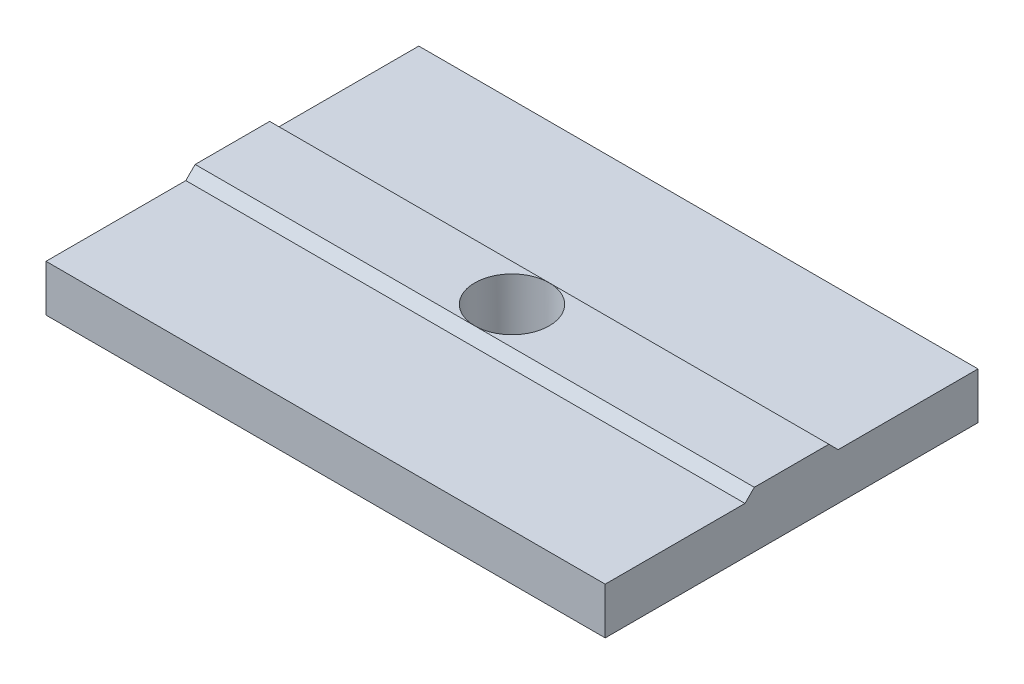
ISO-10303-21;
HEADER;
FILE_DESCRIPTION(('STEP AP214'),'2;1');
FILE_NAME('part.step','',(''),(''),'','','');
FILE_SCHEMA(('AUTOMOTIVE_DESIGN { 1 0 10303 214 1 1 1 1 }'));
ENDSEC;
DATA;
#1=APPLICATION_CONTEXT('core data for automotive mechanical design processes');
#2=APPLICATION_PROTOCOL_DEFINITION('international standard','automotive_design',2000,#1);
#3=PRODUCT_CONTEXT('',#1,'mechanical');
#4=PRODUCT('Part','Part','',(#3));
#5=PRODUCT_RELATED_PRODUCT_CATEGORY('part','',(#4));
#6=PRODUCT_DEFINITION_FORMATION('','',#4);
#7=PRODUCT_DEFINITION_CONTEXT('part definition',#1,'design');
#8=PRODUCT_DEFINITION('design','',#6,#7);
#9=PRODUCT_DEFINITION_SHAPE('','',#8);
#10=(LENGTH_UNIT() NAMED_UNIT(*) SI_UNIT(.MILLI.,.METRE.));
#11=(NAMED_UNIT(*) PLANE_ANGLE_UNIT() SI_UNIT($,.RADIAN.));
#12=(NAMED_UNIT(*) SI_UNIT($,.STERADIAN.) SOLID_ANGLE_UNIT());
#13=UNCERTAINTY_MEASURE_WITH_UNIT(LENGTH_MEASURE(1.E-05),#10,'distance_accuracy_value','');
#14=(GEOMETRIC_REPRESENTATION_CONTEXT(3) GLOBAL_UNCERTAINTY_ASSIGNED_CONTEXT((#13)) GLOBAL_UNIT_ASSIGNED_CONTEXT((#10,
#11,#12)) REPRESENTATION_CONTEXT('',''));
#15=CARTESIAN_POINT('',(0.,0.,0.));
#16=DIRECTION('',(0.,0.,1.));
#17=DIRECTION('',(1.,0.,0.));
#18=AXIS2_PLACEMENT_3D('',#15,#16,#17);
#19=CARTESIAN_POINT('',(0.,6.,0.));
#20=DIRECTION('',(0.,1.,0.));
#21=DIRECTION('',(0.,0.,1.));
#22=AXIS2_PLACEMENT_3D('',#19,#20,#21);
#23=PLANE('',#22);
#24=CARTESIAN_POINT('',(0.,6.,0.));
#25=DIRECTION('',(0.,1.,0.));
#26=DIRECTION('',(0.,0.,1.));
#27=AXIS2_PLACEMENT_3D('',#24,#25,#26);
#28=CIRCLE('',#27,4.);
#29=CARTESIAN_POINT('',(0.,6.,3.99999999999999));
#30=VERTEX_POINT('',#29);
#31=CARTESIAN_POINT('',(0.,6.,-3.99999999999999));
#32=VERTEX_POINT('',#31);
#33=EDGE_CURVE('E63',#30,#32,#28,.T.);
#34=ORIENTED_EDGE('',*,*,#33,.F.);
#35=DIRECTION('',(1.,0.,0.));
#36=VECTOR('',#35,1.);
#37=CARTESIAN_POINT('',(30.,6.,3.99999999999999));
#38=LINE('',#37,#36);
#39=CARTESIAN_POINT('',(30.,6.,3.99999999999999));
#40=VERTEX_POINT('',#39);
#41=EDGE_CURVE('E128',#30,#40,#38,.T.);
#42=ORIENTED_EDGE('',*,*,#41,.T.);
#43=DIRECTION('',(0.,0.,-1.));
#44=VECTOR('',#43,1.);
#45=CARTESIAN_POINT('',(30.,6.,5.));
#46=LINE('',#45,#44);
#47=CARTESIAN_POINT('',(30.,6.,-3.99999999999999));
#48=VERTEX_POINT('',#47);
#49=EDGE_CURVE('E165',#40,#48,#46,.T.);
#50=ORIENTED_EDGE('',*,*,#49,.T.);
#51=DIRECTION('',(-1.,0.,0.));
#52=VECTOR('',#51,1.);
#53=CARTESIAN_POINT('',(-30.,6.,-3.99999999999999));
#54=LINE('',#53,#52);
#55=EDGE_CURVE('E131',#48,#32,#54,.T.);
#56=ORIENTED_EDGE('',*,*,#55,.T.);
#57=EDGE_LOOP('',(#34,#42,#50,#56));
#58=FACE_BOUND('',#57,.T.);
#59=ADVANCED_FACE('F47',(#58),#23,.T.);
#60=CARTESIAN_POINT('',(0.,5.,0.));
#61=DIRECTION('',(0.,1.,0.));
#62=DIRECTION('',(0.,0.,1.));
#63=AXIS2_PLACEMENT_3D('',#60,#61,#62);
#64=PLANE('',#63);
#65=DIRECTION('',(0.,0.,-1.));
#66=VECTOR('',#65,1.);
#67=CARTESIAN_POINT('',(30.,5.,20.));
#68=LINE('',#67,#66);
#69=CARTESIAN_POINT('',(30.,5.,20.));
#70=VERTEX_POINT('',#69);
#71=CARTESIAN_POINT('',(30.,5.,5.));
#72=VERTEX_POINT('',#71);
#73=EDGE_CURVE('E164',#70,#72,#68,.T.);
#74=ORIENTED_EDGE('',*,*,#73,.T.);
#75=DIRECTION('',(-1.,0.,0.));
#76=VECTOR('',#75,1.);
#77=CARTESIAN_POINT('',(0.,5.,5.));
#78=LINE('',#77,#76);
#79=CARTESIAN_POINT('',(-30.,5.,5.));
#80=VERTEX_POINT('',#79);
#81=EDGE_CURVE('E168',#72,#80,#78,.T.);
#82=ORIENTED_EDGE('',*,*,#81,.T.);
#83=DIRECTION('',(0.,0.,1.));
#84=VECTOR('',#83,1.);
#85=CARTESIAN_POINT('',(-30.,5.,20.));
#86=LINE('',#85,#84);
#87=CARTESIAN_POINT('',(-30.,5.,20.));
#88=VERTEX_POINT('',#87);
#89=EDGE_CURVE('E192',#80,#88,#86,.T.);
#90=ORIENTED_EDGE('',*,*,#89,.T.);
#91=DIRECTION('',(1.,0.,0.));
#92=VECTOR('',#91,1.);
#93=CARTESIAN_POINT('',(30.,5.,20.));
#94=LINE('',#93,#92);
#95=EDGE_CURVE('E171',#88,#70,#94,.T.);
#96=ORIENTED_EDGE('',*,*,#95,.T.);
#97=EDGE_LOOP('',(#74,#82,#90,#96));
#98=FACE_BOUND('',#97,.T.);
#99=ADVANCED_FACE('F167',(#98),#64,.T.);
#100=CARTESIAN_POINT('',(-30.,5.,-20.));
#101=VERTEX_POINT('',#100);
#102=CARTESIAN_POINT('',(-30.,5.,-5.));
#103=VERTEX_POINT('',#102);
#104=EDGE_CURVE('E188',#101,#103,#86,.T.);
#105=ORIENTED_EDGE('',*,*,#104,.T.);
#106=DIRECTION('',(1.,0.,0.));
#107=VECTOR('',#106,1.);
#108=CARTESIAN_POINT('',(0.,5.,-5.));
#109=LINE('',#108,#107);
#110=CARTESIAN_POINT('',(30.,5.,-5.));
#111=VERTEX_POINT('',#110);
#112=EDGE_CURVE('E179',#103,#111,#109,.T.);
#113=ORIENTED_EDGE('',*,*,#112,.T.);
#114=CARTESIAN_POINT('',(30.,5.,-20.));
#115=VERTEX_POINT('',#114);
#116=EDGE_CURVE('E175',#111,#115,#68,.T.);
#117=ORIENTED_EDGE('',*,*,#116,.T.);
#118=DIRECTION('',(-1.,0.,0.));
#119=VECTOR('',#118,1.);
#120=CARTESIAN_POINT('',(30.,5.,-20.));
#121=LINE('',#120,#119);
#122=EDGE_CURVE('E174',#115,#101,#121,.T.);
#123=ORIENTED_EDGE('',*,*,#122,.T.);
#124=EDGE_LOOP('',(#105,#113,#117,#123));
#125=FACE_BOUND('',#124,.T.);
#126=ADVANCED_FACE('F234',(#125),#64,.T.);
#127=CARTESIAN_POINT('',(-30.,5.,20.));
#128=DIRECTION('',(1.,0.,0.));
#129=DIRECTION('',(0.,0.,-1.));
#130=AXIS2_PLACEMENT_3D('',#127,#128,#129);
#131=PLANE('',#130);
#132=DIRECTION('',(0.,0.,1.));
#133=VECTOR('',#132,1.);
#134=CARTESIAN_POINT('',(-30.,6.,5.));
#135=LINE('',#134,#133);
#136=CARTESIAN_POINT('',(-30.,6.,-3.99999999999999));
#137=VERTEX_POINT('',#136);
#138=CARTESIAN_POINT('',(-30.,6.,3.99999999999999));
#139=VERTEX_POINT('',#138);
#140=EDGE_CURVE('E145',#137,#139,#135,.T.);
#141=ORIENTED_EDGE('',*,*,#140,.F.);
#142=DIRECTION('',(0.,-0.707106781186548,-0.707106781186548));
#143=VECTOR('',#142,1.);
#144=CARTESIAN_POINT('',(-30.,6.,-3.99999999999999));
#145=LINE('',#144,#143);
#146=EDGE_CURVE('E157',#137,#103,#145,.T.);
#147=ORIENTED_EDGE('',*,*,#146,.T.);
#148=ORIENTED_EDGE('',*,*,#104,.F.);
#149=DIRECTION('',(0.,-1.,0.));
#150=VECTOR('',#149,1.);
#151=CARTESIAN_POINT('',(-30.,5.,-20.));
#152=LINE('',#151,#150);
#153=CARTESIAN_POINT('',(-30.,0.,-20.));
#154=VERTEX_POINT('',#153);
#155=EDGE_CURVE('E196',#101,#154,#152,.T.);
#156=ORIENTED_EDGE('',*,*,#155,.T.);
#157=DIRECTION('',(0.,0.,1.));
#158=VECTOR('',#157,1.);
#159=CARTESIAN_POINT('',(-30.,0.,20.));
#160=LINE('',#159,#158);
#161=CARTESIAN_POINT('',(-30.,0.,20.));
#162=VERTEX_POINT('',#161);
#163=EDGE_CURVE('E178',#154,#162,#160,.T.);
#164=ORIENTED_EDGE('',*,*,#163,.T.);
#165=DIRECTION('',(0.,-1.,0.));
#166=VECTOR('',#165,1.);
#167=CARTESIAN_POINT('',(-30.,5.,20.));
#168=LINE('',#167,#166);
#169=EDGE_CURVE('E140',#88,#162,#168,.T.);
#170=ORIENTED_EDGE('',*,*,#169,.F.);
#171=ORIENTED_EDGE('',*,*,#89,.F.);
#172=DIRECTION('',(0.,0.707106781186548,-0.707106781186548));
#173=VECTOR('',#172,1.);
#174=CARTESIAN_POINT('',(-30.,6.,3.99999999999999));
#175=LINE('',#174,#173);
#176=EDGE_CURVE('E154',#80,#139,#175,.T.);
#177=ORIENTED_EDGE('',*,*,#176,.T.);
#178=EDGE_LOOP('',(#141,#147,#148,#156,#164,#170,#171,#177));
#179=FACE_BOUND('',#178,.T.);
#180=ADVANCED_FACE('F222',(#179),#131,.F.);
#181=CARTESIAN_POINT('',(30.,5.,20.));
#182=DIRECTION('',(0.,0.,-1.));
#183=DIRECTION('',(-1.,0.,0.));
#184=AXIS2_PLACEMENT_3D('',#181,#182,#183);
#185=PLANE('',#184);
#186=DIRECTION('',(1.,0.,0.));
#187=VECTOR('',#186,1.);
#188=CARTESIAN_POINT('',(30.,0.,20.));
#189=LINE('',#188,#187);
#190=CARTESIAN_POINT('',(30.,0.,20.));
#191=VERTEX_POINT('',#190);
#192=EDGE_CURVE('E183',#162,#191,#189,.T.);
#193=ORIENTED_EDGE('',*,*,#192,.T.);
#194=DIRECTION('',(0.,-1.,0.));
#195=VECTOR('',#194,1.);
#196=CARTESIAN_POINT('',(30.,5.,20.));
#197=LINE('',#196,#195);
#198=EDGE_CURVE('E212',#70,#191,#197,.T.);
#199=ORIENTED_EDGE('',*,*,#198,.F.);
#200=ORIENTED_EDGE('',*,*,#95,.F.);
#201=ORIENTED_EDGE('',*,*,#169,.T.);
#202=EDGE_LOOP('',(#193,#199,#200,#201));
#203=FACE_BOUND('',#202,.T.);
#204=ADVANCED_FACE('F219',(#203),#185,.F.);
#205=CARTESIAN_POINT('',(30.,5.,20.));
#206=DIRECTION('',(-1.,0.,0.));
#207=DIRECTION('',(0.,0.,1.));
#208=AXIS2_PLACEMENT_3D('',#205,#206,#207);
#209=PLANE('',#208);
#210=ORIENTED_EDGE('',*,*,#116,.F.);
#211=DIRECTION('',(0.,0.707106781186548,0.707106781186548));
#212=VECTOR('',#211,1.);
#213=CARTESIAN_POINT('',(30.,6.,-3.99999999999999));
#214=LINE('',#213,#212);
#215=EDGE_CURVE('E11',#111,#48,#214,.T.);
#216=ORIENTED_EDGE('',*,*,#215,.T.);
#217=ORIENTED_EDGE('',*,*,#49,.F.);
#218=DIRECTION('',(0.,-0.707106781186548,0.707106781186548));
#219=VECTOR('',#218,1.);
#220=CARTESIAN_POINT('',(30.,6.,3.99999999999999));
#221=LINE('',#220,#219);
#222=EDGE_CURVE('E57',#40,#72,#221,.T.);
#223=ORIENTED_EDGE('',*,*,#222,.T.);
#224=ORIENTED_EDGE('',*,*,#73,.F.);
#225=ORIENTED_EDGE('',*,*,#198,.T.);
#226=DIRECTION('',(0.,0.,-1.));
#227=VECTOR('',#226,1.);
#228=CARTESIAN_POINT('',(30.,0.,20.));
#229=LINE('',#228,#227);
#230=CARTESIAN_POINT('',(30.,0.,-20.));
#231=VERTEX_POINT('',#230);
#232=EDGE_CURVE('E200',#191,#231,#229,.T.);
#233=ORIENTED_EDGE('',*,*,#232,.T.);
#234=DIRECTION('',(0.,-1.,0.));
#235=VECTOR('',#234,1.);
#236=CARTESIAN_POINT('',(30.,5.,-20.));
#237=LINE('',#236,#235);
#238=EDGE_CURVE('E209',#115,#231,#237,.T.);
#239=ORIENTED_EDGE('',*,*,#238,.F.);
#240=EDGE_LOOP('',(#210,#216,#217,#223,#224,#225,#233,#239));
#241=FACE_BOUND('',#240,.T.);
#242=ADVANCED_FACE('F162',(#241),#209,.F.);
#243=CARTESIAN_POINT('',(30.,5.,-20.));
#244=DIRECTION('',(0.,0.,1.));
#245=DIRECTION('',(1.,0.,0.));
#246=AXIS2_PLACEMENT_3D('',#243,#244,#245);
#247=PLANE('',#246);
#248=DIRECTION('',(-1.,0.,0.));
#249=VECTOR('',#248,1.);
#250=CARTESIAN_POINT('',(30.,0.,-20.));
#251=LINE('',#250,#249);
#252=EDGE_CURVE('E203',#231,#154,#251,.T.);
#253=ORIENTED_EDGE('',*,*,#252,.T.);
#254=ORIENTED_EDGE('',*,*,#155,.F.);
#255=ORIENTED_EDGE('',*,*,#122,.F.);
#256=ORIENTED_EDGE('',*,*,#238,.T.);
#257=EDGE_LOOP('',(#253,#254,#255,#256));
#258=FACE_BOUND('',#257,.T.);
#259=ADVANCED_FACE('F232',(#258),#247,.F.);
#260=CARTESIAN_POINT('',(0.,0.,0.));
#261=DIRECTION('',(0.,1.,0.));
#262=DIRECTION('',(0.,0.,1.));
#263=AXIS2_PLACEMENT_3D('',#260,#261,#262);
#264=PLANE('',#263);
#265=CARTESIAN_POINT('',(0.,0.,0.));
#266=DIRECTION('',(0.,1.,0.));
#267=DIRECTION('',(0.,0.,1.));
#268=AXIS2_PLACEMENT_3D('',#265,#266,#267);
#269=CIRCLE('',#268,4.);
#270=CARTESIAN_POINT('',(0.,0.,4.));
#271=VERTEX_POINT('',#270);
#272=EDGE_CURVE('E133',#271,#271,#269,.T.);
#273=ORIENTED_EDGE('',*,*,#272,.T.);
#274=EDGE_LOOP('',(#273));
#275=FACE_BOUND('',#274,.T.);
#276=ORIENTED_EDGE('',*,*,#252,.F.);
#277=ORIENTED_EDGE('',*,*,#232,.F.);
#278=ORIENTED_EDGE('',*,*,#192,.F.);
#279=ORIENTED_EDGE('',*,*,#163,.F.);
#280=EDGE_LOOP('',(#276,#277,#278,#279));
#281=FACE_BOUND('',#280,.T.);
#282=ADVANCED_FACE('F228',(#275,#281),#264,.F.);
#283=EDGE_CURVE('E117',#32,#30,#28,.T.);
#284=ORIENTED_EDGE('',*,*,#283,.F.);
#285=EDGE_CURVE('E147',#32,#137,#54,.T.);
#286=ORIENTED_EDGE('',*,*,#285,.T.);
#287=ORIENTED_EDGE('',*,*,#140,.T.);
#288=EDGE_CURVE('E137',#139,#30,#38,.T.);
#289=ORIENTED_EDGE('',*,*,#288,.T.);
#290=EDGE_LOOP('',(#284,#286,#287,#289));
#291=FACE_BOUND('',#290,.T.);
#292=ADVANCED_FACE('F143',(#291),#23,.T.);
#293=CARTESIAN_POINT('',(0.,6.,-3.99999999999999));
#294=DIRECTION('',(0.,0.707106781186547,-0.707106781186547));
#295=DIRECTION('',(1.,0.,0.));
#296=AXIS2_PLACEMENT_3D('',#293,#294,#295);
#297=PLANE('',#296);
#298=ORIENTED_EDGE('',*,*,#215,.F.);
#299=ORIENTED_EDGE('',*,*,#112,.F.);
#300=ORIENTED_EDGE('',*,*,#146,.F.);
#301=ORIENTED_EDGE('',*,*,#285,.F.);
#302=ORIENTED_EDGE('',*,*,#55,.F.);
#303=EDGE_LOOP('',(#298,#299,#300,#301,#302));
#304=FACE_BOUND('',#303,.T.);
#305=ADVANCED_FACE('F239',(#304),#297,.T.);
#306=CARTESIAN_POINT('',(0.,6.,3.99999999999999));
#307=DIRECTION('',(0.,0.707106781186547,0.707106781186547));
#308=DIRECTION('',(-1.,0.,0.));
#309=AXIS2_PLACEMENT_3D('',#306,#307,#308);
#310=PLANE('',#309);
#311=ORIENTED_EDGE('',*,*,#176,.F.);
#312=ORIENTED_EDGE('',*,*,#81,.F.);
#313=ORIENTED_EDGE('',*,*,#222,.F.);
#314=ORIENTED_EDGE('',*,*,#41,.F.);
#315=ORIENTED_EDGE('',*,*,#288,.F.);
#316=EDGE_LOOP('',(#311,#312,#313,#314,#315));
#317=FACE_BOUND('',#316,.T.);
#318=ADVANCED_FACE('F50',(#317),#310,.T.);
#319=CARTESIAN_POINT('',(0.,-1.2E-05,0.));
#320=DIRECTION('',(0.,1.,0.));
#321=DIRECTION('',(0.,0.,1.));
#322=AXIS2_PLACEMENT_3D('',#319,#320,#321);
#323=CYLINDRICAL_SURFACE('',#322,4.);
#324=ORIENTED_EDGE('',*,*,#33,.T.);
#325=ORIENTED_EDGE('',*,*,#283,.T.);
#326=EDGE_LOOP('',(#324,#325));
#327=FACE_BOUND('',#326,.T.);
#328=ORIENTED_EDGE('',*,*,#272,.F.);
#329=EDGE_LOOP('',(#328));
#330=FACE_BOUND('',#329,.T.);
#331=ADVANCED_FACE('F118',(#327,#330),#323,.F.);
#332=CLOSED_SHELL('',(#59,#99,#126,#180,#204,#242,#259,#282,#292,#305,#318,#331));
#333=MANIFOLD_SOLID_BREP('B2',#332);
#334=ADVANCED_BREP_SHAPE_REPRESENTATION('',(#18,#333),#14);
#335=SHAPE_DEFINITION_REPRESENTATION(#9,#334);
ENDSEC;
END-ISO-10303-21;
